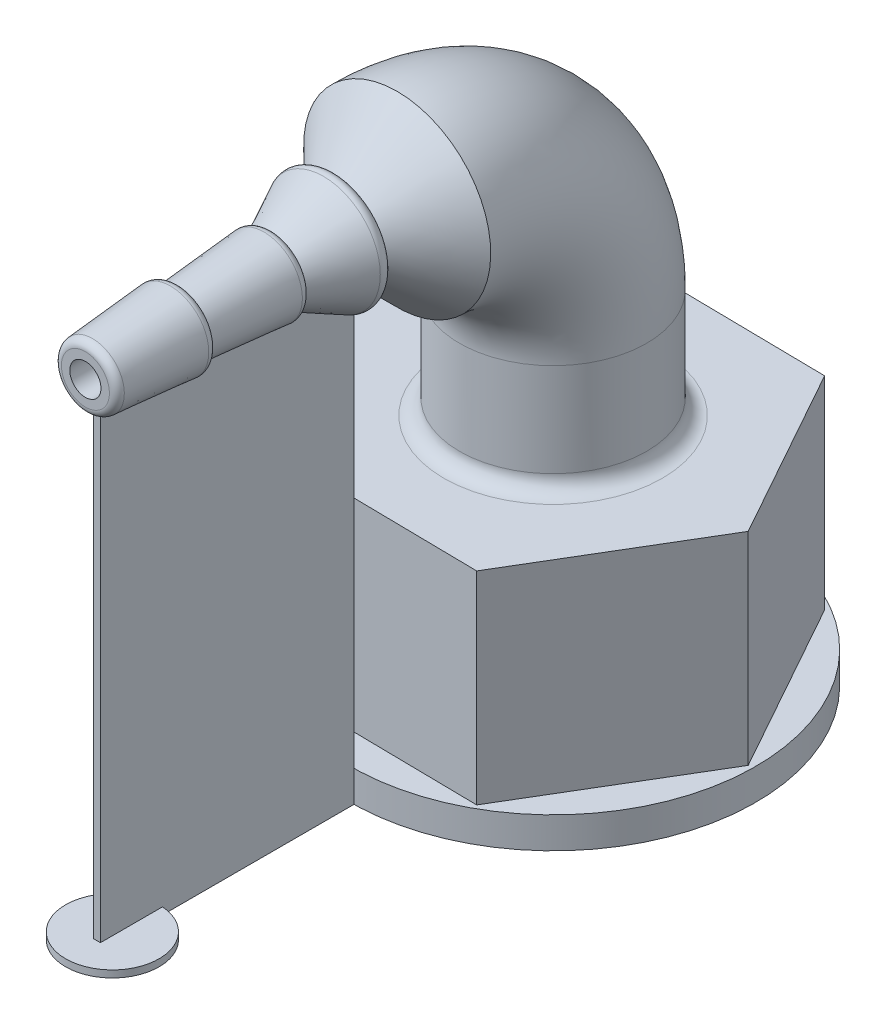
ISO-10303-21;
HEADER;
FILE_DESCRIPTION(('STEP AP214'),'2;1');
FILE_NAME('part.step','',(''),(''),'','','');
FILE_SCHEMA(('AUTOMOTIVE_DESIGN { 1 0 10303 214 1 1 1 1 }'));
ENDSEC;
DATA;
#1=APPLICATION_CONTEXT('core data for automotive mechanical design processes');
#2=APPLICATION_PROTOCOL_DEFINITION('international standard','automotive_design',2000,#1);
#3=PRODUCT_CONTEXT('',#1,'mechanical');
#4=PRODUCT('Part','Part','',(#3));
#5=PRODUCT_RELATED_PRODUCT_CATEGORY('part','',(#4));
#6=PRODUCT_DEFINITION_FORMATION('','',#4);
#7=PRODUCT_DEFINITION_CONTEXT('part definition',#1,'design');
#8=PRODUCT_DEFINITION('design','',#6,#7);
#9=PRODUCT_DEFINITION_SHAPE('','',#8);
#10=(LENGTH_UNIT() NAMED_UNIT(*) SI_UNIT(.MILLI.,.METRE.));
#11=(NAMED_UNIT(*) PLANE_ANGLE_UNIT() SI_UNIT($,.RADIAN.));
#12=(NAMED_UNIT(*) SI_UNIT($,.STERADIAN.) SOLID_ANGLE_UNIT());
#13=UNCERTAINTY_MEASURE_WITH_UNIT(LENGTH_MEASURE(1.E-05),#10,'distance_accuracy_value','');
#14=(GEOMETRIC_REPRESENTATION_CONTEXT(3) GLOBAL_UNCERTAINTY_ASSIGNED_CONTEXT((#13)) GLOBAL_UNIT_ASSIGNED_CONTEXT((#10,
#11,#12)) REPRESENTATION_CONTEXT('',''));
#15=CARTESIAN_POINT('',(0.,0.,0.));
#16=DIRECTION('',(0.,0.,1.));
#17=DIRECTION('',(1.,0.,0.));
#18=AXIS2_PLACEMENT_3D('',#15,#16,#17);
#19=CARTESIAN_POINT('',(0.225,-2.,29.2603334278676));
#20=DIRECTION('',(0.,0.,-1.));
#21=DIRECTION('',(-1.,0.,0.));
#22=AXIS2_PLACEMENT_3D('',#19,#20,#21);
#23=PLANE('',#22);
#24=DIRECTION('',(-1.,0.,0.));
#25=VECTOR('',#24,1.);
#26=CARTESIAN_POINT('',(0.225,-1.55,29.2603334278676));
#27=LINE('',#26,#25);
#28=CARTESIAN_POINT('',(0.225,-1.55,29.2603334278676));
#29=VERTEX_POINT('',#28);
#30=CARTESIAN_POINT('',(-0.225,-1.55,29.2603334278676));
#31=VERTEX_POINT('',#30);
#32=EDGE_CURVE('E153',#29,#31,#27,.T.);
#33=ORIENTED_EDGE('',*,*,#32,.F.);
#34=DIRECTION('',(0.,-1.,0.));
#35=VECTOR('',#34,1.);
#36=CARTESIAN_POINT('',(0.225,-2.,29.2603334278676));
#37=LINE('',#36,#35);
#38=CARTESIAN_POINT('',(0.225,27.938361118989,29.2603334278676));
#39=VERTEX_POINT('',#38);
#40=EDGE_CURVE('E135',#39,#29,#37,.T.);
#41=ORIENTED_EDGE('',*,*,#40,.F.);
#42=DIRECTION('',(-1.,0.,0.));
#43=VECTOR('',#42,1.);
#44=CARTESIAN_POINT('',(0.225,27.938361118989,29.2603334278676));
#45=LINE('',#44,#43);
#46=CARTESIAN_POINT('',(-0.225,27.938361118989,29.2603334278676));
#47=VERTEX_POINT('',#46);
#48=EDGE_CURVE('E137',#39,#47,#45,.T.);
#49=ORIENTED_EDGE('',*,*,#48,.T.);
#50=DIRECTION('',(0.,-1.,0.));
#51=VECTOR('',#50,1.);
#52=CARTESIAN_POINT('',(-0.225,-2.,29.2603334278676));
#53=LINE('',#52,#51);
#54=EDGE_CURVE('E127',#47,#31,#53,.T.);
#55=ORIENTED_EDGE('',*,*,#54,.T.);
#56=EDGE_LOOP('',(#33,#41,#49,#55));
#57=FACE_BOUND('',#56,.T.);
#58=ADVANCED_FACE('F51',(#57),#23,.F.);
#59=CARTESIAN_POINT('',(0.225,-2.,13.));
#60=DIRECTION('',(0.,1.,0.));
#61=DIRECTION('',(0.,0.,1.));
#62=AXIS2_PLACEMENT_3D('',#59,#60,#61);
#63=PLANE('',#62);
#64=DIRECTION('',(0.,0.,-1.));
#65=VECTOR('',#64,1.);
#66=CARTESIAN_POINT('',(0.225,-2.,13.));
#67=LINE('',#66,#65);
#68=CARTESIAN_POINT('',(0.225,-2.,25.2790268081864));
#69=VERTEX_POINT('',#68);
#70=CARTESIAN_POINT('',(0.225,-2.,13.));
#71=VERTEX_POINT('',#70);
#72=EDGE_CURVE('E94',#69,#71,#67,.T.);
#73=ORIENTED_EDGE('',*,*,#72,.F.);
#74=CARTESIAN_POINT('',(0.,-2.,28.2705774094633));
#75=DIRECTION('',(0.,-1.,0.));
#76=DIRECTION('',(0.,0.,-1.));
#77=AXIS2_PLACEMENT_3D('',#74,#75,#76);
#78=CIRCLE('',#77,3.);
#79=CARTESIAN_POINT('',(-0.225,-2.,25.2790268081864));
#80=VERTEX_POINT('',#79);
#81=EDGE_CURVE('E66',#69,#80,#78,.T.);
#82=ORIENTED_EDGE('',*,*,#81,.T.);
#83=DIRECTION('',(0.,0.,-1.));
#84=VECTOR('',#83,1.);
#85=CARTESIAN_POINT('',(-0.225,-2.,13.));
#86=LINE('',#85,#84);
#87=CARTESIAN_POINT('',(-0.225,-2.,13.));
#88=VERTEX_POINT('',#87);
#89=EDGE_CURVE('E121',#80,#88,#86,.T.);
#90=ORIENTED_EDGE('',*,*,#89,.T.);
#91=DIRECTION('',(-1.,0.,0.));
#92=VECTOR('',#91,1.);
#93=CARTESIAN_POINT('',(0.225,-2.,13.));
#94=LINE('',#93,#92);
#95=EDGE_CURVE('E125',#71,#88,#94,.T.);
#96=ORIENTED_EDGE('',*,*,#95,.F.);
#97=EDGE_LOOP('',(#73,#82,#90,#96));
#98=FACE_BOUND('',#97,.T.);
#99=ADVANCED_FACE('F53',(#98),#63,.F.);
#100=CARTESIAN_POINT('',(0.225,27.938361118989,13.));
#101=DIRECTION('',(0.,0.,1.));
#102=DIRECTION('',(1.,0.,0.));
#103=AXIS2_PLACEMENT_3D('',#100,#101,#102);
#104=PLANE('',#103);
#105=DIRECTION('',(0.,1.,0.));
#106=VECTOR('',#105,1.);
#107=CARTESIAN_POINT('',(-0.225,27.938361118989,13.));
#108=LINE('',#107,#106);
#109=CARTESIAN_POINT('',(-0.225,27.938361118989,13.));
#110=VERTEX_POINT('',#109);
#111=EDGE_CURVE('E139',#88,#110,#108,.T.);
#112=ORIENTED_EDGE('',*,*,#111,.T.);
#113=DIRECTION('',(-1.,0.,0.));
#114=VECTOR('',#113,1.);
#115=CARTESIAN_POINT('',(0.225,27.938361118989,13.));
#116=LINE('',#115,#114);
#117=CARTESIAN_POINT('',(0.225,27.938361118989,13.));
#118=VERTEX_POINT('',#117);
#119=EDGE_CURVE('E143',#118,#110,#116,.T.);
#120=ORIENTED_EDGE('',*,*,#119,.F.);
#121=DIRECTION('',(0.,1.,0.));
#122=VECTOR('',#121,1.);
#123=CARTESIAN_POINT('',(0.225,27.938361118989,13.));
#124=LINE('',#123,#122);
#125=EDGE_CURVE('E126',#71,#118,#124,.T.);
#126=ORIENTED_EDGE('',*,*,#125,.F.);
#127=ORIENTED_EDGE('',*,*,#95,.T.);
#128=EDGE_LOOP('',(#112,#120,#126,#127));
#129=FACE_BOUND('',#128,.T.);
#130=ADVANCED_FACE('F158',(#129),#104,.F.);
#131=CARTESIAN_POINT('',(0.225,27.938361118989,29.2603334278676));
#132=DIRECTION('',(0.,-1.,0.));
#133=DIRECTION('',(0.,0.,-1.));
#134=AXIS2_PLACEMENT_3D('',#131,#132,#133);
#135=PLANE('',#134);
#136=DIRECTION('',(0.,0.,1.));
#137=VECTOR('',#136,1.);
#138=CARTESIAN_POINT('',(-0.225,27.938361118989,29.2603334278676));
#139=LINE('',#138,#137);
#140=EDGE_CURVE('E90',#110,#47,#139,.T.);
#141=ORIENTED_EDGE('',*,*,#140,.T.);
#142=ORIENTED_EDGE('',*,*,#48,.F.);
#143=DIRECTION('',(0.,0.,1.));
#144=VECTOR('',#143,1.);
#145=CARTESIAN_POINT('',(0.225,27.938361118989,29.2603334278676));
#146=LINE('',#145,#144);
#147=EDGE_CURVE('E74',#118,#39,#146,.T.);
#148=ORIENTED_EDGE('',*,*,#147,.F.);
#149=ORIENTED_EDGE('',*,*,#119,.T.);
#150=EDGE_LOOP('',(#141,#142,#148,#149));
#151=FACE_BOUND('',#150,.T.);
#152=ADVANCED_FACE('F154',(#151),#135,.F.);
#153=CARTESIAN_POINT('',(0.225,0.,0.));
#154=DIRECTION('',(-1.,0.,0.));
#155=DIRECTION('',(0.,0.,1.));
#156=AXIS2_PLACEMENT_3D('',#153,#154,#155);
#157=PLANE('',#156);
#158=DIRECTION('',(0.,0.,1.));
#159=VECTOR('',#158,1.);
#160=CARTESIAN_POINT('',(0.225,-1.55,0.));
#161=LINE('',#160,#159);
#162=CARTESIAN_POINT('',(0.225,-1.55,25.2790268081864));
#163=VERTEX_POINT('',#162);
#164=EDGE_CURVE('E120',#163,#29,#161,.T.);
#165=ORIENTED_EDGE('',*,*,#164,.F.);
#166=DIRECTION('',(0.,-1.,0.));
#167=VECTOR('',#166,1.);
#168=CARTESIAN_POINT('',(0.225,-1.55,25.2790268081864));
#169=LINE('',#168,#167);
#170=EDGE_CURVE('E112',#163,#69,#169,.T.);
#171=ORIENTED_EDGE('',*,*,#170,.T.);
#172=ORIENTED_EDGE('',*,*,#72,.T.);
#173=ORIENTED_EDGE('',*,*,#125,.T.);
#174=ORIENTED_EDGE('',*,*,#147,.T.);
#175=ORIENTED_EDGE('',*,*,#40,.T.);
#176=EDGE_LOOP('',(#165,#171,#172,#173,#174,#175));
#177=FACE_BOUND('',#176,.T.);
#178=ADVANCED_FACE('F119',(#177),#157,.F.);
#179=CARTESIAN_POINT('',(-0.225,0.,0.));
#180=DIRECTION('',(-1.,0.,0.));
#181=DIRECTION('',(0.,0.,1.));
#182=AXIS2_PLACEMENT_3D('',#179,#180,#181);
#183=PLANE('',#182);
#184=DIRECTION('',(0.,-1.,0.));
#185=VECTOR('',#184,1.);
#186=CARTESIAN_POINT('',(-0.225,-1.55,25.2790268081864));
#187=LINE('',#186,#185);
#188=CARTESIAN_POINT('',(-0.225,-1.55,25.2790268081864));
#189=VERTEX_POINT('',#188);
#190=EDGE_CURVE('E12',#189,#80,#187,.T.);
#191=ORIENTED_EDGE('',*,*,#190,.F.);
#192=DIRECTION('',(0.,0.,1.));
#193=VECTOR('',#192,1.);
#194=CARTESIAN_POINT('',(-0.225,-1.55,0.));
#195=LINE('',#194,#193);
#196=EDGE_CURVE('E59',#189,#31,#195,.T.);
#197=ORIENTED_EDGE('',*,*,#196,.T.);
#198=ORIENTED_EDGE('',*,*,#54,.F.);
#199=ORIENTED_EDGE('',*,*,#140,.F.);
#200=ORIENTED_EDGE('',*,*,#111,.F.);
#201=ORIENTED_EDGE('',*,*,#89,.F.);
#202=EDGE_LOOP('',(#191,#197,#198,#199,#200,#201));
#203=FACE_BOUND('',#202,.T.);
#204=ADVANCED_FACE('F148',(#203),#183,.T.);
#205=CARTESIAN_POINT('',(0.,-1.55,28.2705774094633));
#206=DIRECTION('',(0.,-1.,0.));
#207=DIRECTION('',(0.,0.,-1.));
#208=AXIS2_PLACEMENT_3D('',#205,#206,#207);
#209=CYLINDRICAL_SURFACE('',#208,3.);
#210=ORIENTED_EDGE('',*,*,#170,.F.);
#211=CARTESIAN_POINT('',(0.,-1.55,28.2705774094633));
#212=DIRECTION('',(0.,-1.,0.));
#213=DIRECTION('',(0.,0.,-1.));
#214=AXIS2_PLACEMENT_3D('',#211,#212,#213);
#215=CIRCLE('',#214,3.);
#216=EDGE_CURVE('E116',#163,#189,#215,.T.);
#217=ORIENTED_EDGE('',*,*,#216,.T.);
#218=ORIENTED_EDGE('',*,*,#190,.T.);
#219=ORIENTED_EDGE('',*,*,#81,.F.);
#220=EDGE_LOOP('',(#210,#217,#218,#219));
#221=FACE_BOUND('',#220,.T.);
#222=ADVANCED_FACE('F110',(#221),#209,.T.);
#223=CARTESIAN_POINT('',(0.,-1.55,28.2705774094633));
#224=DIRECTION('',(0.,-1.,0.));
#225=DIRECTION('',(0.,0.,-1.));
#226=AXIS2_PLACEMENT_3D('',#223,#224,#225);
#227=PLANE('',#226);
#228=ORIENTED_EDGE('',*,*,#216,.F.);
#229=ORIENTED_EDGE('',*,*,#164,.T.);
#230=ORIENTED_EDGE('',*,*,#32,.T.);
#231=ORIENTED_EDGE('',*,*,#196,.F.);
#232=EDGE_LOOP('',(#228,#229,#230,#231));
#233=FACE_BOUND('',#232,.T.);
#234=ADVANCED_FACE('F176',(#233),#227,.F.);
#235=CLOSED_SHELL('',(#58,#99,#130,#152,#178,#204,#222,#234));
#236=MANIFOLD_SOLID_BREP('B2',#235);
#237=CARTESIAN_POINT('',(0.,30.,30.));
#238=DIRECTION('',(0.,0.,1.));
#239=DIRECTION('',(0.,-1.,0.));
#240=AXIS2_PLACEMENT_3D('',#237,#238,#239);
#241=PLANE('',#240);
#242=CARTESIAN_POINT('',(0.,30.,30.));
#243=DIRECTION('',(0.,0.,1.));
#244=DIRECTION('',(0.,-1.,0.));
#245=AXIS2_PLACEMENT_3D('',#242,#243,#244);
#246=CIRCLE('',#245,1.53993355921699);
#247=CARTESIAN_POINT('',(0.,28.460066440783,30.));
#248=VERTEX_POINT('',#247);
#249=EDGE_CURVE('E49',#248,#248,#246,.T.);
#250=ORIENTED_EDGE('',*,*,#249,.T.);
#251=EDGE_LOOP('',(#250));
#252=FACE_BOUND('',#251,.T.);
#253=CARTESIAN_POINT('',(0.,30.,30.));
#254=DIRECTION('',(0.,0.,1.));
#255=DIRECTION('',(0.,-1.,0.));
#256=AXIS2_PLACEMENT_3D('',#253,#254,#255);
#257=CIRCLE('',#256,1.);
#258=CARTESIAN_POINT('',(0.,29.,30.));
#259=VERTEX_POINT('',#258);
#260=EDGE_CURVE('E503',#259,#259,#257,.F.);
#261=ORIENTED_EDGE('',*,*,#260,.T.);
#262=EDGE_LOOP('',(#261));
#263=FACE_BOUND('',#262,.T.);
#264=ADVANCED_FACE('F229',(#252,#263),#241,.T.);
#265=CARTESIAN_POINT('',(0.,0.,0.));
#266=DIRECTION('',(0.,1.,0.));
#267=DIRECTION('',(0.,0.,1.));
#268=AXIS2_PLACEMENT_3D('',#265,#266,#267);
#269=PLANE('',#268);
#270=CARTESIAN_POINT('',(0.,0.,0.));
#271=DIRECTION('',(0.,1.,0.));
#272=DIRECTION('',(0.,0.,1.));
#273=AXIS2_PLACEMENT_3D('',#270,#271,#272);
#274=CIRCLE('',#273,4.75);
#275=CARTESIAN_POINT('',(0.,0.,-4.75));
#276=VERTEX_POINT('',#275);
#277=EDGE_CURVE('E307',#276,#276,#274,.T.);
#278=ORIENTED_EDGE('',*,*,#277,.T.);
#279=EDGE_LOOP('',(#278));
#280=FACE_BOUND('',#279,.T.);
#281=CARTESIAN_POINT('',(0.,0.,0.));
#282=DIRECTION('',(0.,-1.,0.));
#283=DIRECTION('',(0.,0.,-1.));
#284=AXIS2_PLACEMENT_3D('',#281,#282,#283);
#285=CIRCLE('',#284,4.76999631989262);
#286=CARTESIAN_POINT('',(0.,0.,-4.76999631989262));
#287=VERTEX_POINT('',#286);
#288=EDGE_CURVE('E516',#287,#287,#285,.T.);
#289=ORIENTED_EDGE('',*,*,#288,.T.);
#290=EDGE_LOOP('',(#289));
#291=FACE_BOUND('',#290,.T.);
#292=ADVANCED_FACE('F397',(#280,#291),#269,.F.);
#293=CARTESIAN_POINT('',(0.,13.,0.));
#294=DIRECTION('',(0.,1.,0.));
#295=DIRECTION('',(0.,0.,1.));
#296=AXIS2_PLACEMENT_3D('',#293,#294,#295);
#297=PLANE('',#296);
#298=CARTESIAN_POINT('',(0.,13.,0.));
#299=DIRECTION('',(0.,1.,0.));
#300=DIRECTION('',(0.,0.,1.));
#301=AXIS2_PLACEMENT_3D('',#298,#299,#300);
#302=CIRCLE('',#301,7.);
#303=CARTESIAN_POINT('',(0.,13.,7.));
#304=VERTEX_POINT('',#303);
#305=EDGE_CURVE('E349',#304,#304,#302,.F.);
#306=ORIENTED_EDGE('',*,*,#305,.T.);
#307=EDGE_LOOP('',(#306));
#308=FACE_BOUND('',#307,.T.);
#309=DIRECTION('',(-0.487283169368928,0.,-0.873244016784411));
#310=VECTOR('',#309,1.);
#311=CARTESIAN_POINT('',(12.7003479437025,13.,0.185729486687596));
#312=LINE('',#311,#310);
#313=CARTESIAN_POINT('',(12.7003479437025,13.,0.185729486687596));
#314=VERTEX_POINT('',#313);
#315=CARTESIAN_POINT('',(6.51102042555455,13.,-10.905959212804));
#316=VERTEX_POINT('',#315);
#317=EDGE_CURVE('E329',#314,#316,#312,.T.);
#318=ORIENTED_EDGE('',*,*,#317,.T.);
#319=DIRECTION('',(-0.999893086922529,0.,-0.0146224048821186));
#320=VECTOR('',#319,1.);
#321=CARTESIAN_POINT('',(6.51102042555455,13.,-10.905959212804));
#322=LINE('',#321,#320);
#323=CARTESIAN_POINT('',(-6.18932751814794,13.,-11.0916886994916));
#324=VERTEX_POINT('',#323);
#325=EDGE_CURVE('E296',#316,#324,#322,.T.);
#326=ORIENTED_EDGE('',*,*,#325,.T.);
#327=DIRECTION('',(-0.5126099175536,0.,0.858621611902292));
#328=VECTOR('',#327,1.);
#329=CARTESIAN_POINT('',(-6.18932751814794,13.,-11.0916886994916));
#330=LINE('',#329,#328);
#331=CARTESIAN_POINT('',(-12.7003479437025,13.,-0.185729486687596));
#332=VERTEX_POINT('',#331);
#333=EDGE_CURVE('E541',#324,#332,#330,.T.);
#334=ORIENTED_EDGE('',*,*,#333,.T.);
#335=DIRECTION('',(0.487283169368928,0.,0.873244016784411));
#336=VECTOR('',#335,1.);
#337=CARTESIAN_POINT('',(-12.7003479437025,13.,-0.185729486687596));
#338=LINE('',#337,#336);
#339=CARTESIAN_POINT('',(-6.51102042555454,13.,10.905959212804));
#340=VERTEX_POINT('',#339);
#341=EDGE_CURVE('E544',#332,#340,#338,.T.);
#342=ORIENTED_EDGE('',*,*,#341,.T.);
#343=DIRECTION('',(0.999893086922529,0.,0.0146224048821183));
#344=VECTOR('',#343,1.);
#345=CARTESIAN_POINT('',(-6.51102042555454,13.,10.905959212804));
#346=LINE('',#345,#344);
#347=CARTESIAN_POINT('',(6.18932751814794,13.,11.0916886994916));
#348=VERTEX_POINT('',#347);
#349=EDGE_CURVE('E546',#340,#348,#346,.T.);
#350=ORIENTED_EDGE('',*,*,#349,.T.);
#351=DIRECTION('',(0.5126099175536,0.,-0.858621611902293));
#352=VECTOR('',#351,1.);
#353=CARTESIAN_POINT('',(6.18932751814794,13.,11.0916886994916));
#354=LINE('',#353,#352);
#355=EDGE_CURVE('E246',#348,#314,#354,.T.);
#356=ORIENTED_EDGE('',*,*,#355,.T.);
#357=EDGE_LOOP('',(#318,#326,#334,#342,#350,#356));
#358=FACE_BOUND('',#357,.T.);
#359=ADVANCED_FACE('F403',(#308,#358),#297,.T.);
#360=CARTESIAN_POINT('',(12.7003479437025,13.,0.185729486687596));
#361=DIRECTION('',(-0.873244016784411,0.,0.487283169368928));
#362=DIRECTION('',(0.487283169368928,0.,0.873244016784411));
#363=AXIS2_PLACEMENT_3D('',#360,#361,#362);
#364=PLANE('',#363);
#365=DIRECTION('',(-0.487283169368928,0.,-0.873244016784411));
#366=VECTOR('',#365,1.);
#367=CARTESIAN_POINT('',(12.7003479437025,0.,0.185729486687596));
#368=LINE('',#367,#366);
#369=CARTESIAN_POINT('',(12.7003479437025,0.,0.185729486687596));
#370=VERTEX_POINT('',#369);
#371=CARTESIAN_POINT('',(6.51102042555455,0.,-10.905959212804));
#372=VERTEX_POINT('',#371);
#373=EDGE_CURVE('E284',#370,#372,#368,.T.);
#374=ORIENTED_EDGE('',*,*,#373,.T.);
#375=DIRECTION('',(0.,-1.,0.));
#376=VECTOR('',#375,1.);
#377=CARTESIAN_POINT('',(6.51102042555455,13.,-10.905959212804));
#378=LINE('',#377,#376);
#379=EDGE_CURVE('E294',#316,#372,#378,.T.);
#380=ORIENTED_EDGE('',*,*,#379,.F.);
#381=ORIENTED_EDGE('',*,*,#317,.F.);
#382=DIRECTION('',(0.,-1.,0.));
#383=VECTOR('',#382,1.);
#384=CARTESIAN_POINT('',(12.7003479437025,13.,0.185729486687596));
#385=LINE('',#384,#383);
#386=EDGE_CURVE('E305',#314,#370,#385,.T.);
#387=ORIENTED_EDGE('',*,*,#386,.T.);
#388=EDGE_LOOP('',(#374,#380,#381,#387));
#389=FACE_BOUND('',#388,.T.);
#390=ADVANCED_FACE('F304',(#389),#364,.F.);
#391=CARTESIAN_POINT('',(6.51102042555455,13.,-10.905959212804));
#392=DIRECTION('',(-0.0146224048821186,0.,0.999893086922529));
#393=DIRECTION('',(0.999893086922529,0.,0.0146224048821186));
#394=AXIS2_PLACEMENT_3D('',#391,#392,#393);
#395=PLANE('',#394);
#396=DIRECTION('',(-0.999893086922529,0.,-0.0146224048821186));
#397=VECTOR('',#396,1.);
#398=CARTESIAN_POINT('',(6.51102042555455,0.,-10.905959212804));
#399=LINE('',#398,#397);
#400=CARTESIAN_POINT('',(-6.18932751814794,0.,-11.0916886994916));
#401=VERTEX_POINT('',#400);
#402=EDGE_CURVE('E279',#372,#401,#399,.T.);
#403=ORIENTED_EDGE('',*,*,#402,.T.);
#404=DIRECTION('',(0.,-1.,0.));
#405=VECTOR('',#404,1.);
#406=CARTESIAN_POINT('',(-6.18932751814794,13.,-11.0916886994916));
#407=LINE('',#406,#405);
#408=EDGE_CURVE('E301',#324,#401,#407,.T.);
#409=ORIENTED_EDGE('',*,*,#408,.F.);
#410=ORIENTED_EDGE('',*,*,#325,.F.);
#411=ORIENTED_EDGE('',*,*,#379,.T.);
#412=EDGE_LOOP('',(#403,#409,#410,#411));
#413=FACE_BOUND('',#412,.T.);
#414=ADVANCED_FACE('F295',(#413),#395,.F.);
#415=CARTESIAN_POINT('',(-6.18932751814794,13.,-11.0916886994916));
#416=DIRECTION('',(0.858621611902293,0.,0.5126099175536));
#417=DIRECTION('',(0.5126099175536,0.,-0.858621611902293));
#418=AXIS2_PLACEMENT_3D('',#415,#416,#417);
#419=PLANE('',#418);
#420=DIRECTION('',(-0.5126099175536,0.,0.858621611902292));
#421=VECTOR('',#420,1.);
#422=CARTESIAN_POINT('',(-6.18932751814794,0.,-11.0916886994916));
#423=LINE('',#422,#421);
#424=CARTESIAN_POINT('',(-12.7003479437025,0.,-0.185729486687596));
#425=VERTEX_POINT('',#424);
#426=EDGE_CURVE('E287',#401,#425,#423,.T.);
#427=ORIENTED_EDGE('',*,*,#426,.T.);
#428=DIRECTION('',(0.,-1.,0.));
#429=VECTOR('',#428,1.);
#430=CARTESIAN_POINT('',(-12.7003479437025,13.,-0.185729486687596));
#431=LINE('',#430,#429);
#432=EDGE_CURVE('E340',#332,#425,#431,.T.);
#433=ORIENTED_EDGE('',*,*,#432,.F.);
#434=ORIENTED_EDGE('',*,*,#333,.F.);
#435=ORIENTED_EDGE('',*,*,#408,.T.);
#436=EDGE_LOOP('',(#427,#433,#434,#435));
#437=FACE_BOUND('',#436,.T.);
#438=ADVANCED_FACE('F453',(#437),#419,.F.);
#439=CARTESIAN_POINT('',(-12.7003479437025,13.,-0.185729486687596));
#440=DIRECTION('',(0.873244016784411,0.,-0.487283169368928));
#441=DIRECTION('',(-0.487283169368928,0.,-0.873244016784411));
#442=AXIS2_PLACEMENT_3D('',#439,#440,#441);
#443=PLANE('',#442);
#444=DIRECTION('',(0.487283169368928,0.,0.873244016784411));
#445=VECTOR('',#444,1.);
#446=CARTESIAN_POINT('',(-12.7003479437025,0.,-0.185729486687596));
#447=LINE('',#446,#445);
#448=CARTESIAN_POINT('',(-6.51102042555454,0.,10.905959212804));
#449=VERTEX_POINT('',#448);
#450=EDGE_CURVE('E318',#425,#449,#447,.T.);
#451=ORIENTED_EDGE('',*,*,#450,.T.);
#452=DIRECTION('',(0.,-1.,0.));
#453=VECTOR('',#452,1.);
#454=CARTESIAN_POINT('',(-6.51102042555454,13.,10.905959212804));
#455=LINE('',#454,#453);
#456=EDGE_CURVE('E336',#340,#449,#455,.T.);
#457=ORIENTED_EDGE('',*,*,#456,.F.);
#458=ORIENTED_EDGE('',*,*,#341,.F.);
#459=ORIENTED_EDGE('',*,*,#432,.T.);
#460=EDGE_LOOP('',(#451,#457,#458,#459));
#461=FACE_BOUND('',#460,.T.);
#462=ADVANCED_FACE('F449',(#461),#443,.F.);
#463=CARTESIAN_POINT('',(-6.51102042555454,13.,10.905959212804));
#464=DIRECTION('',(0.0146224048821183,0.,-0.999893086922529));
#465=DIRECTION('',(-0.999893086922529,0.,-0.0146224048821183));
#466=AXIS2_PLACEMENT_3D('',#463,#464,#465);
#467=PLANE('',#466);
#468=DIRECTION('',(0.999893086922529,0.,0.0146224048821183));
#469=VECTOR('',#468,1.);
#470=CARTESIAN_POINT('',(-6.51102042555454,0.,10.905959212804));
#471=LINE('',#470,#469);
#472=CARTESIAN_POINT('',(6.18932751814794,0.,11.0916886994916));
#473=VERTEX_POINT('',#472);
#474=EDGE_CURVE('E322',#449,#473,#471,.T.);
#475=ORIENTED_EDGE('',*,*,#474,.T.);
#476=DIRECTION('',(0.,-1.,0.));
#477=VECTOR('',#476,1.);
#478=CARTESIAN_POINT('',(6.18932751814794,13.,11.0916886994916));
#479=LINE('',#478,#477);
#480=EDGE_CURVE('E332',#348,#473,#479,.T.);
#481=ORIENTED_EDGE('',*,*,#480,.F.);
#482=ORIENTED_EDGE('',*,*,#349,.F.);
#483=ORIENTED_EDGE('',*,*,#456,.T.);
#484=EDGE_LOOP('',(#475,#481,#482,#483));
#485=FACE_BOUND('',#484,.T.);
#486=ADVANCED_FACE('F445',(#485),#467,.F.);
#487=CARTESIAN_POINT('',(6.18932751814794,13.,11.0916886994916));
#488=DIRECTION('',(-0.858621611902293,0.,-0.5126099175536));
#489=DIRECTION('',(-0.5126099175536,0.,0.858621611902293));
#490=AXIS2_PLACEMENT_3D('',#487,#488,#489);
#491=PLANE('',#490);
#492=DIRECTION('',(0.5126099175536,0.,-0.858621611902293));
#493=VECTOR('',#492,1.);
#494=CARTESIAN_POINT('',(6.18932751814794,0.,11.0916886994916));
#495=LINE('',#494,#493);
#496=EDGE_CURVE('E326',#473,#370,#495,.T.);
#497=ORIENTED_EDGE('',*,*,#496,.T.);
#498=ORIENTED_EDGE('',*,*,#386,.F.);
#499=ORIENTED_EDGE('',*,*,#355,.F.);
#500=ORIENTED_EDGE('',*,*,#480,.T.);
#501=EDGE_LOOP('',(#497,#498,#499,#500));
#502=FACE_BOUND('',#501,.T.);
#503=ADVANCED_FACE('F438',(#502),#491,.F.);
#504=CARTESIAN_POINT('',(0.,13.,0.));
#505=DIRECTION('',(0.,-1.,0.));
#506=DIRECTION('',(0.,0.,-1.));
#507=AXIS2_PLACEMENT_3D('',#504,#505,#506);
#508=CYLINDRICAL_SURFACE('',#507,4.75);
#509=CARTESIAN_POINT('',(0.,13.25,0.));
#510=DIRECTION('',(0.,-1.,0.));
#511=DIRECTION('',(0.,0.,-1.));
#512=AXIS2_PLACEMENT_3D('',#509,#510,#511);
#513=CIRCLE('',#512,4.75);
#514=CARTESIAN_POINT('',(0.,13.25,-4.75));
#515=VERTEX_POINT('',#514);
#516=EDGE_CURVE('E357',#515,#515,#513,.F.);
#517=CARTESIAN_POINT('',(0.,13.25,-4.75));
#518=CARTESIAN_POINT('',(0.,13.1119791666667,-4.75));
#519=CARTESIAN_POINT('',(0.,12.9739583333334,-4.75));
#520=CARTESIAN_POINT('',(0.,12.6979166666667,-4.75));
#521=CARTESIAN_POINT('',(0.,12.5598958333334,-4.75));
#522=CARTESIAN_POINT('',(0.,12.2838541666667,-4.75));
#523=CARTESIAN_POINT('',(0.,12.1458333333334,-4.75));
#524=CARTESIAN_POINT('',(0.,11.8697916666667,-4.75));
#525=CARTESIAN_POINT('',(0.,11.7317708333334,-4.75));
#526=CARTESIAN_POINT('',(0.,11.4557291666667,-4.75));
#527=CARTESIAN_POINT('',(0.,11.3177083333334,-4.75));
#528=CARTESIAN_POINT('',(0.,11.0416666666667,-4.75));
#529=CARTESIAN_POINT('',(0.,10.9036458333334,-4.75));
#530=CARTESIAN_POINT('',(0.,10.6276041666667,-4.75));
#531=CARTESIAN_POINT('',(0.,10.4895833333334,-4.75));
#532=CARTESIAN_POINT('',(0.,10.2135416666667,-4.75));
#533=CARTESIAN_POINT('',(0.,10.0755208333334,-4.75));
#534=CARTESIAN_POINT('',(0.,9.79947916666669,-4.75));
#535=CARTESIAN_POINT('',(0.,9.66145833333336,-4.75));
#536=CARTESIAN_POINT('',(0.,9.38541666666669,-4.75));
#537=CARTESIAN_POINT('',(0.,9.24739583333336,-4.75));
#538=CARTESIAN_POINT('',(0.,8.97135416666669,-4.75));
#539=CARTESIAN_POINT('',(0.,8.83333333333336,-4.75));
#540=CARTESIAN_POINT('',(0.,8.55729166666669,-4.75));
#541=CARTESIAN_POINT('',(0.,8.41927083333336,-4.75));
#542=CARTESIAN_POINT('',(0.,8.14322916666669,-4.75));
#543=CARTESIAN_POINT('',(0.,8.00520833333335,-4.75));
#544=CARTESIAN_POINT('',(0.,7.72916666666669,-4.75));
#545=CARTESIAN_POINT('',(0.,7.59114583333335,-4.75));
#546=CARTESIAN_POINT('',(0.,7.31510416666668,-4.75));
#547=CARTESIAN_POINT('',(0.,7.17708333333335,-4.75));
#548=CARTESIAN_POINT('',(0.,6.90104166666668,-4.75));
#549=CARTESIAN_POINT('',(0.,6.76302083333335,-4.75));
#550=CARTESIAN_POINT('',(0.,6.48697916666668,-4.75));
#551=CARTESIAN_POINT('',(0.,6.34895833333335,-4.75));
#552=CARTESIAN_POINT('',(0.,6.07291666666668,-4.75));
#553=CARTESIAN_POINT('',(0.,5.93489583333335,-4.75));
#554=CARTESIAN_POINT('',(0.,5.65885416666668,-4.75));
#555=CARTESIAN_POINT('',(0.,5.52083333333335,-4.75));
#556=CARTESIAN_POINT('',(0.,5.24479166666668,-4.75));
#557=CARTESIAN_POINT('',(0.,5.10677083333335,-4.75));
#558=CARTESIAN_POINT('',(0.,4.83072916666668,-4.75));
#559=CARTESIAN_POINT('',(0.,4.69270833333334,-4.75));
#560=CARTESIAN_POINT('',(0.,4.41666666666668,-4.75));
#561=CARTESIAN_POINT('',(0.,4.27864583333335,-4.75));
#562=CARTESIAN_POINT('',(0.,4.00260416666668,-4.75));
#563=CARTESIAN_POINT('',(0.,3.86458333333334,-4.75));
#564=CARTESIAN_POINT('',(0.,3.58854166666668,-4.75));
#565=CARTESIAN_POINT('',(0.,3.45052083333334,-4.75));
#566=CARTESIAN_POINT('',(0.,3.17447916666668,-4.75));
#567=CARTESIAN_POINT('',(0.,3.03645833333334,-4.75));
#568=CARTESIAN_POINT('',(0.,2.76041666666667,-4.75));
#569=CARTESIAN_POINT('',(0.,2.62239583333334,-4.75));
#570=CARTESIAN_POINT('',(0.,2.34635416666667,-4.75));
#571=CARTESIAN_POINT('',(0.,2.20833333333334,-4.75));
#572=CARTESIAN_POINT('',(0.,1.93229166666667,-4.75));
#573=CARTESIAN_POINT('',(0.,1.79427083333334,-4.75));
#574=CARTESIAN_POINT('',(0.,1.51822916666667,-4.75));
#575=CARTESIAN_POINT('',(0.,1.38020833333334,-4.75));
#576=CARTESIAN_POINT('',(0.,1.10416666666667,-4.75));
#577=CARTESIAN_POINT('',(0.,0.966145833333337,-4.75));
#578=CARTESIAN_POINT('',(0.,0.690104166666669,-4.75));
#579=CARTESIAN_POINT('',(0.,0.552083333333336,-4.75));
#580=CARTESIAN_POINT('',(0.,0.276041666666669,-4.75));
#581=CARTESIAN_POINT('',(0.,0.138020833333334,-4.75));
#582=CARTESIAN_POINT('',(0.,0.,-4.75));
#583=B_SPLINE_CURVE_WITH_KNOTS('',3,(#517,#518,#519,#520,#521,#522,#523,#524,#525,#526,#527,
#528,#529,#530,#531,#532,#533,#534,#535,#536,#537,#538,#539,#540,#541,#542,#543,#544,#545,#546,
#547,#548,#549,#550,#551,#552,#553,#554,#555,#556,#557,#558,#559,#560,#561,#562,#563,#564,#565,
#566,#567,#568,#569,#570,#571,#572,#573,#574,#575,#576,#577,#578,#579,#580,#581,#582),
.UNSPECIFIED.,.F.,.F.,(4,2,2,2,2,2,2,2,2,2,2,2,2,2,2,2,2,2,2,2,2,2,2,2,2,2,2,2,2,2,2,2,4),(0.,
0.4140625,0.828125000000001,1.2421875,1.65625,2.0703125,2.48437500000001,2.89843750000001,
3.31250000000001,3.72656250000001,4.14062500000001,4.55468750000001,4.96875000000001,
5.38281250000001,5.79687500000001,6.21093750000001,6.62500000000001,7.03906250000002,
7.45312500000002,7.86718750000002,8.28125000000002,8.69531250000002,9.10937500000002,
9.52343750000002,9.93750000000002,10.3515625,10.765625,11.1796875,11.59375,12.0078125,12.421875,
12.8359375,13.25),.UNSPECIFIED.);
#584=EDGE_CURVE('BSEAM429',#515,#276,#583,.T.);
#585=ORIENTED_EDGE('',*,*,#516,.T.);
#586=ORIENTED_EDGE('',*,*,#277,.F.);
#587=ORIENTED_EDGE('',*,*,#584,.T.);
#588=ORIENTED_EDGE('',*,*,#584,.F.);
#589=EDGE_LOOP('',(#585,#587,#586,#588));
#590=FACE_BOUND('',#589,.T.);
#591=ADVANCED_FACE('F429',(#590),#508,.F.);
#592=CARTESIAN_POINT('',(0.,-2.,0.));
#593=DIRECTION('',(0.,-1.,0.));
#594=DIRECTION('',(0.,0.,-1.));
#595=AXIS2_PLACEMENT_3D('',#592,#593,#594);
#596=PLANE('',#595);
#597=CARTESIAN_POINT('',(0.,-2.,0.));
#598=DIRECTION('',(0.,-1.,0.));
#599=DIRECTION('',(0.,0.,-1.));
#600=AXIS2_PLACEMENT_3D('',#597,#598,#599);
#601=CIRCLE('',#600,13.);
#602=CARTESIAN_POINT('',(0.,-2.,-13.));
#603=VERTEX_POINT('',#602);
#604=EDGE_CURVE('E311',#603,#603,#601,.T.);
#605=ORIENTED_EDGE('',*,*,#604,.T.);
#606=EDGE_LOOP('',(#605));
#607=FACE_BOUND('',#606,.T.);
#608=CARTESIAN_POINT('',(0.,-2.,0.));
#609=DIRECTION('',(0.,-1.,0.));
#610=DIRECTION('',(0.,0.,-1.));
#611=AXIS2_PLACEMENT_3D('',#608,#609,#610);
#612=CIRCLE('',#611,4.76999631989262);
#613=CARTESIAN_POINT('',(0.,-2.,-4.76999631989262));
#614=VERTEX_POINT('',#613);
#615=EDGE_CURVE('E523',#614,#614,#612,.T.);
#616=ORIENTED_EDGE('',*,*,#615,.F.);
#617=EDGE_LOOP('',(#616));
#618=FACE_BOUND('',#617,.T.);
#619=ADVANCED_FACE('F426',(#607,#618),#596,.T.);
#620=CARTESIAN_POINT('',(0.,0.,0.));
#621=DIRECTION('',(0.,-1.,0.));
#622=DIRECTION('',(0.,0.,-1.));
#623=AXIS2_PLACEMENT_3D('',#620,#621,#622);
#624=PLANE('',#623);
#625=ORIENTED_EDGE('',*,*,#373,.F.);
#626=ORIENTED_EDGE('',*,*,#496,.F.);
#627=ORIENTED_EDGE('',*,*,#474,.F.);
#628=ORIENTED_EDGE('',*,*,#450,.F.);
#629=ORIENTED_EDGE('',*,*,#426,.F.);
#630=ORIENTED_EDGE('',*,*,#402,.F.);
#631=EDGE_LOOP('',(#625,#626,#627,#628,#629,#630));
#632=FACE_BOUND('',#631,.T.);
#633=CARTESIAN_POINT('',(0.,0.,0.));
#634=DIRECTION('',(0.,-1.,0.));
#635=DIRECTION('',(0.,0.,-1.));
#636=AXIS2_PLACEMENT_3D('',#633,#634,#635);
#637=CIRCLE('',#636,13.);
#638=CARTESIAN_POINT('',(0.,0.,-13.));
#639=VERTEX_POINT('',#638);
#640=EDGE_CURVE('E527',#639,#639,#637,.T.);
#641=ORIENTED_EDGE('',*,*,#640,.F.);
#642=EDGE_LOOP('',(#641));
#643=FACE_BOUND('',#642,.T.);
#644=ADVANCED_FACE('F281',(#632,#643),#624,.F.);
#645=CARTESIAN_POINT('',(0.,-2.,0.));
#646=DIRECTION('',(0.,1.,0.));
#647=DIRECTION('',(0.,0.,1.));
#648=AXIS2_PLACEMENT_3D('',#645,#646,#647);
#649=CYLINDRICAL_SURFACE('',#648,13.);
#650=ORIENTED_EDGE('',*,*,#604,.F.);
#651=EDGE_LOOP('',(#650));
#652=FACE_BOUND('',#651,.T.);
#653=ORIENTED_EDGE('',*,*,#640,.T.);
#654=EDGE_LOOP('',(#653));
#655=FACE_BOUND('',#654,.T.);
#656=ADVANCED_FACE('F424',(#652,#655),#649,.T.);
#657=CARTESIAN_POINT('',(0.,-2.,0.));
#658=DIRECTION('',(0.,1.,0.));
#659=DIRECTION('',(0.,0.,1.));
#660=AXIS2_PLACEMENT_3D('',#657,#658,#659);
#661=CYLINDRICAL_SURFACE('',#660,4.76999631989262);
#662=ORIENTED_EDGE('',*,*,#615,.T.);
#663=EDGE_LOOP('',(#662));
#664=FACE_BOUND('',#663,.T.);
#665=ORIENTED_EDGE('',*,*,#288,.F.);
#666=EDGE_LOOP('',(#665));
#667=FACE_BOUND('',#666,.T.);
#668=ADVANCED_FACE('F415',(#664,#667),#661,.F.);
#669=CARTESIAN_POINT('',(0.,19.9999999999999,10.0000000000001));
#670=DIRECTION('',(-1.,0.,0.));
#671=DIRECTION('',(0.,0.,1.));
#672=AXIS2_PLACEMENT_3D('',#669,#670,#671);
#673=TOROIDAL_SURFACE('',#672,10.0000000000001,6.);
#674=CARTESIAN_POINT('',(0.,30.,10.0000000000001));
#675=DIRECTION('',(0.,0.,1.));
#676=DIRECTION('',(0.,-1.,0.));
#677=AXIS2_PLACEMENT_3D('',#674,#675,#676);
#678=CIRCLE('',#677,6.);
#679=CARTESIAN_POINT('',(0.,36.,10.0000000000001));
#680=VERTEX_POINT('',#679);
#681=EDGE_CURVE('E499',#680,#680,#678,.T.);
#682=CARTESIAN_POINT('',(0.,19.9999999999999,0.));
#683=DIRECTION('',(0.,1.,0.));
#684=DIRECTION('',(0.,0.,1.));
#685=AXIS2_PLACEMENT_3D('',#682,#683,#684);
#686=CIRCLE('',#685,6.);
#687=CARTESIAN_POINT('',(0.,19.9999999999999,-6.));
#688=VERTEX_POINT('',#687);
#689=EDGE_CURVE('E508',#688,#688,#686,.T.);
#690=CARTESIAN_POINT('',(0.,19.9999999999999,10.0000000000001));
#691=DIRECTION('',(-1.,0.,0.));
#692=DIRECTION('',(0.,0.,1.));
#693=AXIS2_PLACEMENT_3D('',#690,#691,#692);
#694=CIRCLE('',#693,16.0000000000001);
#695=EDGE_CURVE('',#680,#688,#694,.T.);
#696=ORIENTED_EDGE('',*,*,#681,.F.);
#697=ORIENTED_EDGE('',*,*,#689,.T.);
#698=ORIENTED_EDGE('',*,*,#695,.T.);
#699=ORIENTED_EDGE('',*,*,#695,.F.);
#700=EDGE_LOOP('',(#696,#698,#697,#699));
#701=FACE_BOUND('',#700,.T.);
#702=ADVANCED_FACE('F411',(#701),#673,.T.);
#703=CARTESIAN_POINT('',(0.,19.9999999999999,0.));
#704=DIRECTION('',(0.,-1.,0.));
#705=DIRECTION('',(0.,0.,-1.));
#706=AXIS2_PLACEMENT_3D('',#703,#704,#705);
#707=CYLINDRICAL_SURFACE('',#706,6.);
#708=CARTESIAN_POINT('',(0.,14.,0.));
#709=DIRECTION('',(0.,1.,0.));
#710=DIRECTION('',(0.,0.,1.));
#711=AXIS2_PLACEMENT_3D('',#708,#709,#710);
#712=CIRCLE('',#711,6.);
#713=CARTESIAN_POINT('',(0.,14.,6.));
#714=VERTEX_POINT('',#713);
#715=EDGE_CURVE('E300',#714,#714,#712,.T.);
#716=ORIENTED_EDGE('',*,*,#715,.T.);
#717=EDGE_LOOP('',(#716));
#718=FACE_BOUND('',#717,.T.);
#719=ORIENTED_EDGE('',*,*,#689,.F.);
#720=EDGE_LOOP('',(#719));
#721=FACE_BOUND('',#720,.T.);
#722=ADVANCED_FACE('F414',(#718,#721),#707,.T.);
#723=CARTESIAN_POINT('',(0.,30.,30.));
#724=DIRECTION('',(0.,0.,-1.));
#725=DIRECTION('',(0.,1.,0.));
#726=AXIS2_PLACEMENT_3D('',#723,#724,#725);
#727=CYLINDRICAL_SURFACE('',#726,1.);
#728=CARTESIAN_POINT('',(0.,30.,10.0000000000001));
#729=DIRECTION('',(0.,0.,1.));
#730=DIRECTION('',(0.,-1.,0.));
#731=AXIS2_PLACEMENT_3D('',#728,#729,#730);
#732=CIRCLE('',#731,1.);
#733=CARTESIAN_POINT('',(0.,31.,10.0000000000001));
#734=VERTEX_POINT('',#733);
#735=EDGE_CURVE('E507',#734,#734,#732,.F.);
#736=ORIENTED_EDGE('',*,*,#735,.T.);
#737=EDGE_LOOP('',(#736));
#738=FACE_BOUND('',#737,.T.);
#739=ORIENTED_EDGE('',*,*,#260,.F.);
#740=EDGE_LOOP('',(#739));
#741=FACE_BOUND('',#740,.T.);
#742=ADVANCED_FACE('F420',(#738,#741),#727,.F.);
#743=CARTESIAN_POINT('',(0.,19.9999999999999,10.0000000000001));
#744=DIRECTION('',(-1.,0.,0.));
#745=DIRECTION('',(0.,0.,1.));
#746=AXIS2_PLACEMENT_3D('',#743,#744,#745);
#747=TOROIDAL_SURFACE('',#746,10.0000000000001,1.);
#748=CARTESIAN_POINT('',(0.,19.9999999999999,0.));
#749=DIRECTION('',(0.,1.,0.));
#750=DIRECTION('',(0.,0.,1.));
#751=AXIS2_PLACEMENT_3D('',#748,#749,#750);
#752=CIRCLE('',#751,1.);
#753=CARTESIAN_POINT('',(0.,19.9999999999999,-1.));
#754=VERTEX_POINT('',#753);
#755=EDGE_CURVE('E512',#754,#754,#752,.F.);
#756=CARTESIAN_POINT('',(0.,19.9999999999999,10.0000000000001));
#757=DIRECTION('',(-1.,0.,0.));
#758=DIRECTION('',(0.,0.,1.));
#759=AXIS2_PLACEMENT_3D('',#756,#757,#758);
#760=CIRCLE('',#759,11.0000000000001);
#761=EDGE_CURVE('',#734,#754,#760,.T.);
#762=ORIENTED_EDGE('',*,*,#735,.F.);
#763=ORIENTED_EDGE('',*,*,#755,.T.);
#764=ORIENTED_EDGE('',*,*,#761,.T.);
#765=ORIENTED_EDGE('',*,*,#761,.F.);
#766=EDGE_LOOP('',(#762,#764,#763,#765));
#767=FACE_BOUND('',#766,.T.);
#768=ADVANCED_FACE('F581',(#767),#747,.F.);
#769=CARTESIAN_POINT('',(0.,19.9999999999999,0.));
#770=DIRECTION('',(0.,-1.,0.));
#771=DIRECTION('',(0.,0.,-1.));
#772=AXIS2_PLACEMENT_3D('',#769,#770,#771);
#773=CYLINDRICAL_SURFACE('',#772,1.);
#774=CARTESIAN_POINT('',(0.,17.0000000000001,0.));
#775=DIRECTION('',(0.,1.,0.));
#776=DIRECTION('',(0.,0.,1.));
#777=AXIS2_PLACEMENT_3D('',#774,#775,#776);
#778=CIRCLE('',#777,1.);
#779=CARTESIAN_POINT('',(0.,17.0000000000001,-0.999999999999998));
#780=VERTEX_POINT('',#779);
#781=EDGE_CURVE('E353',#780,#780,#778,.F.);
#782=ORIENTED_EDGE('',*,*,#781,.T.);
#783=EDGE_LOOP('',(#782));
#784=FACE_BOUND('',#783,.T.);
#785=ORIENTED_EDGE('',*,*,#755,.F.);
#786=EDGE_LOOP('',(#785));
#787=FACE_BOUND('',#786,.T.);
#788=ADVANCED_FACE('F409',(#784,#787),#773,.F.);
#789=CARTESIAN_POINT('',(0.,14.,0.));
#790=DIRECTION('',(0.,1.,0.));
#791=DIRECTION('',(0.,0.,1.));
#792=AXIS2_PLACEMENT_3D('',#789,#790,#791);
#793=TOROIDAL_SURFACE('',#792,7.,1.);
#794=ORIENTED_EDGE('',*,*,#305,.F.);
#795=EDGE_LOOP('',(#794));
#796=FACE_BOUND('',#795,.T.);
#797=ORIENTED_EDGE('',*,*,#715,.F.);
#798=EDGE_LOOP('',(#797));
#799=FACE_BOUND('',#798,.T.);
#800=ADVANCED_FACE('F417',(#796,#799),#793,.F.);
#801=CARTESIAN_POINT('',(0.,17.0000000000001,0.));
#802=DIRECTION('',(0.,-1.,0.));
#803=DIRECTION('',(0.,0.,-1.));
#804=AXIS2_PLACEMENT_3D('',#801,#802,#803);
#805=CONICAL_SURFACE('',#804,1.,0.785398163397443);
#806=CARTESIAN_POINT('',(0.,13.25,-4.75));
#807=CARTESIAN_POINT('',(0.,13.2890625,-4.7109375));
#808=CARTESIAN_POINT('',(0.,13.328125,-4.671875));
#809=CARTESIAN_POINT('',(0.,13.40625,-4.59375));
#810=CARTESIAN_POINT('',(0.,13.4453125,-4.5546875));
#811=CARTESIAN_POINT('',(0.,13.5234375,-4.4765625));
#812=CARTESIAN_POINT('',(0.,13.5625,-4.4375));
#813=CARTESIAN_POINT('',(0.,13.640625,-4.359375));
#814=CARTESIAN_POINT('',(0.,13.6796875,-4.3203125));
#815=CARTESIAN_POINT('',(0.,13.7578125,-4.2421875));
#816=CARTESIAN_POINT('',(0.,13.796875,-4.203125));
#817=CARTESIAN_POINT('',(0.,13.875,-4.125));
#818=CARTESIAN_POINT('',(0.,13.9140625,-4.0859375));
#819=CARTESIAN_POINT('',(0.,13.9921875,-4.0078125));
#820=CARTESIAN_POINT('',(0.,14.03125,-3.96875));
#821=CARTESIAN_POINT('',(0.,14.109375,-3.890625));
#822=CARTESIAN_POINT('',(0.,14.1484375,-3.8515625));
#823=CARTESIAN_POINT('',(0.,14.2265625,-3.7734375));
#824=CARTESIAN_POINT('',(0.,14.265625,-3.734375));
#825=CARTESIAN_POINT('',(0.,14.34375,-3.65625));
#826=CARTESIAN_POINT('',(0.,14.3828125,-3.6171875));
#827=CARTESIAN_POINT('',(0.,14.4609375,-3.5390625));
#828=CARTESIAN_POINT('',(0.,14.5,-3.5));
#829=CARTESIAN_POINT('',(0.,14.578125,-3.421875));
#830=CARTESIAN_POINT('',(0.,14.6171875,-3.3828125));
#831=CARTESIAN_POINT('',(0.,14.6953125,-3.3046875));
#832=CARTESIAN_POINT('',(0.,14.734375,-3.265625));
#833=CARTESIAN_POINT('',(0.,14.8125,-3.1875));
#834=CARTESIAN_POINT('',(0.,14.8515625,-3.1484375));
#835=CARTESIAN_POINT('',(0.,14.9296875,-3.0703125));
#836=CARTESIAN_POINT('',(0.,14.96875,-3.03125));
#837=CARTESIAN_POINT('',(0.,15.0468750000001,-2.953125));
#838=CARTESIAN_POINT('',(0.,15.0859375000001,-2.9140625));
#839=CARTESIAN_POINT('',(0.,15.1640625000001,-2.8359375));
#840=CARTESIAN_POINT('',(0.,15.2031250000001,-2.796875));
#841=CARTESIAN_POINT('',(0.,15.2812500000001,-2.71875));
#842=CARTESIAN_POINT('',(0.,15.3203125000001,-2.6796875));
#843=CARTESIAN_POINT('',(0.,15.3984375000001,-2.6015625));
#844=CARTESIAN_POINT('',(0.,15.4375000000001,-2.5625));
#845=CARTESIAN_POINT('',(0.,15.5156250000001,-2.484375));
#846=CARTESIAN_POINT('',(0.,15.5546875000001,-2.4453125));
#847=CARTESIAN_POINT('',(0.,15.6328125000001,-2.3671875));
#848=CARTESIAN_POINT('',(0.,15.6718750000001,-2.328125));
#849=CARTESIAN_POINT('',(0.,15.7500000000001,-2.25));
#850=CARTESIAN_POINT('',(0.,15.7890625000001,-2.2109375));
#851=CARTESIAN_POINT('',(0.,15.8671875000001,-2.1328125));
#852=CARTESIAN_POINT('',(0.,15.9062500000001,-2.09375));
#853=CARTESIAN_POINT('',(0.,15.9843750000001,-2.015625));
#854=CARTESIAN_POINT('',(0.,16.0234375000001,-1.9765625));
#855=CARTESIAN_POINT('',(0.,16.1015625000001,-1.8984375));
#856=CARTESIAN_POINT('',(0.,16.1406250000001,-1.859375));
#857=CARTESIAN_POINT('',(0.,16.2187500000001,-1.78125));
#858=CARTESIAN_POINT('',(0.,16.2578125000001,-1.7421875));
#859=CARTESIAN_POINT('',(0.,16.3359375000001,-1.6640625));
#860=CARTESIAN_POINT('',(0.,16.3750000000001,-1.625));
#861=CARTESIAN_POINT('',(0.,16.4531250000001,-1.546875));
#862=CARTESIAN_POINT('',(0.,16.4921875000001,-1.5078125));
#863=CARTESIAN_POINT('',(0.,16.5703125000001,-1.4296875));
#864=CARTESIAN_POINT('',(0.,16.6093750000001,-1.390625));
#865=CARTESIAN_POINT('',(0.,16.6875000000001,-1.3125));
#866=CARTESIAN_POINT('',(0.,16.7265625000001,-1.2734375));
#867=CARTESIAN_POINT('',(0.,16.8046875000001,-1.1953125));
#868=CARTESIAN_POINT('',(0.,16.8437500000001,-1.15625));
#869=CARTESIAN_POINT('',(0.,16.9218750000001,-1.078125));
#870=CARTESIAN_POINT('',(0.,16.9609375000001,-1.0390625));
#871=CARTESIAN_POINT('',(0.,17.0000000000001,-0.999999999999998));
#872=B_SPLINE_CURVE_WITH_KNOTS('',3,(#806,#807,#808,#809,#810,#811,#812,#813,#814,#815,#816,
#817,#818,#819,#820,#821,#822,#823,#824,#825,#826,#827,#828,#829,#830,#831,#832,#833,#834,#835,
#836,#837,#838,#839,#840,#841,#842,#843,#844,#845,#846,#847,#848,#849,#850,#851,#852,#853,#854,
#855,#856,#857,#858,#859,#860,#861,#862,#863,#864,#865,#866,#867,#868,#869,#870,#871),
.UNSPECIFIED.,.F.,.F.,(4,2,2,2,2,2,2,2,2,2,2,2,2,2,2,2,2,2,2,2,2,2,2,2,2,2,2,2,2,2,2,2,4),(0.,
0.165728151840598,0.331456303681196,0.497184455521794,0.662912607362391,0.828640759202989,
0.994368911043587,1.16009706288419,1.32582521472478,1.49155336656538,1.65728151840598,
1.82300967024658,1.98873782208718,2.15446597392777,2.32019412576837,2.48592227760897,
2.65165042944957,2.81737858129016,2.98310673313076,3.14883488497136,3.31456303681196,
3.48029118865256,3.64601934049316,3.81174749233375,3.97747564417435,4.14320379601495,
4.30893194785555,4.47466009969614,4.64038825153674,4.80611640337734,4.97184455521794,
5.13757270705854,5.30330085889913),.UNSPECIFIED.);
#873=EDGE_CURVE('BSEAM464',#515,#780,#872,.T.);
#874=ORIENTED_EDGE('',*,*,#516,.F.);
#875=ORIENTED_EDGE('',*,*,#781,.F.);
#876=ORIENTED_EDGE('',*,*,#873,.T.);
#877=ORIENTED_EDGE('',*,*,#873,.F.);
#878=EDGE_LOOP('',(#874,#876,#875,#877));
#879=FACE_BOUND('',#878,.T.);
#880=ADVANCED_FACE('F464',(#879),#805,.F.);
#881=CARTESIAN_POINT('',(0.,30.,14.));
#882=DIRECTION('',(0.,0.,-1.));
#883=DIRECTION('',(-1.,0.,0.));
#884=AXIS2_PLACEMENT_3D('',#881,#882,#883);
#885=CONICAL_SURFACE('',#884,2.,0.785398163397459);
#886=ORIENTED_EDGE('',*,*,#681,.T.);
#887=EDGE_LOOP('',(#886));
#888=FACE_BOUND('',#887,.T.);
#889=CARTESIAN_POINT('',(0.,30.,14.));
#890=DIRECTION('',(0.,0.,1.));
#891=DIRECTION('',(1.,0.,0.));
#892=AXIS2_PLACEMENT_3D('',#889,#890,#891);
#893=CIRCLE('',#892,2.);
#894=CARTESIAN_POINT('',(2.,30.,14.));
#895=VERTEX_POINT('',#894);
#896=EDGE_CURVE('E493',#895,#895,#893,.T.);
#897=ORIENTED_EDGE('',*,*,#896,.F.);
#898=EDGE_LOOP('',(#897));
#899=FACE_BOUND('',#898,.T.);
#900=ADVANCED_FACE('F471',(#888,#899),#885,.T.);
#901=CARTESIAN_POINT('',(0.,34.,14.));
#902=DIRECTION('',(0.,0.,-1.));
#903=DIRECTION('',(-1.,0.,0.));
#904=AXIS2_PLACEMENT_3D('',#901,#902,#903);
#905=PLANE('',#904);
#906=CARTESIAN_POINT('',(0.,30.,14.));
#907=DIRECTION('',(0.,0.,-1.));
#908=DIRECTION('',(-1.,0.,0.));
#909=AXIS2_PLACEMENT_3D('',#906,#907,#908);
#910=CIRCLE('',#909,3.19098300562505);
#911=CARTESIAN_POINT('',(-3.19098300562505,30.,14.));
#912=VERTEX_POINT('',#911);
#913=EDGE_CURVE('E365',#912,#912,#910,.T.);
#914=ORIENTED_EDGE('',*,*,#913,.T.);
#915=EDGE_LOOP('',(#914));
#916=FACE_BOUND('',#915,.T.);
#917=ORIENTED_EDGE('',*,*,#896,.T.);
#918=EDGE_LOOP('',(#917));
#919=FACE_BOUND('',#918,.T.);
#920=ADVANCED_FACE('F487',(#916,#919),#905,.T.);
#921=CARTESIAN_POINT('',(0.,30.,18.));
#922=DIRECTION('',(0.,0.,-1.));
#923=DIRECTION('',(-1.,0.,0.));
#924=AXIS2_PLACEMENT_3D('',#921,#922,#923);
#925=CONICAL_SURFACE('',#924,2.,0.463647609000806);
#926=CARTESIAN_POINT('',(0.,30.,14.72360679775));
#927=DIRECTION('',(0.,0.,1.));
#928=DIRECTION('',(1.,0.,0.));
#929=AXIS2_PLACEMENT_3D('',#926,#927,#928);
#930=CIRCLE('',#929,3.63819660112501);
#931=CARTESIAN_POINT('',(3.63819660112501,30.,14.72360679775));
#932=VERTEX_POINT('',#931);
#933=EDGE_CURVE('E361',#932,#932,#930,.T.);
#934=ORIENTED_EDGE('',*,*,#933,.T.);
#935=EDGE_LOOP('',(#934));
#936=FACE_BOUND('',#935,.T.);
#937=CARTESIAN_POINT('',(0.,30.,18.));
#938=DIRECTION('',(0.,0.,1.));
#939=DIRECTION('',(1.,0.,0.));
#940=AXIS2_PLACEMENT_3D('',#937,#938,#939);
#941=CIRCLE('',#940,2.);
#942=CARTESIAN_POINT('',(2.,30.,18.));
#943=VERTEX_POINT('',#942);
#944=EDGE_CURVE('E491',#943,#943,#941,.T.);
#945=ORIENTED_EDGE('',*,*,#944,.F.);
#946=EDGE_LOOP('',(#945));
#947=FACE_BOUND('',#946,.T.);
#948=ADVANCED_FACE('F484',(#936,#947),#925,.T.);
#949=CARTESIAN_POINT('',(0.,30.,24.));
#950=DIRECTION('',(0.,0.,-1.));
#951=DIRECTION('',(-1.,0.,0.));
#952=AXIS2_PLACEMENT_3D('',#949,#950,#951);
#953=CONICAL_SURFACE('',#952,2.,0.0831412318884402);
#954=CARTESIAN_POINT('',(0.,30.,18.5396492168157));
#955=DIRECTION('',(0.,0.,-1.));
#956=DIRECTION('',(-1.,0.,0.));
#957=AXIS2_PLACEMENT_3D('',#954,#955,#956);
#958=CIRCLE('',#957,2.45502923193202);
#959=CARTESIAN_POINT('',(-2.45502923193202,30.,18.5396492168157));
#960=VERTEX_POINT('',#959);
#961=EDGE_CURVE('E369',#960,#960,#958,.F.);
#962=ORIENTED_EDGE('',*,*,#961,.T.);
#963=EDGE_LOOP('',(#962));
#964=FACE_BOUND('',#963,.T.);
#965=CARTESIAN_POINT('',(0.,30.,24.));
#966=DIRECTION('',(0.,0.,1.));
#967=DIRECTION('',(1.,0.,0.));
#968=AXIS2_PLACEMENT_3D('',#965,#966,#967);
#969=CIRCLE('',#968,2.);
#970=CARTESIAN_POINT('',(2.,30.,24.));
#971=VERTEX_POINT('',#970);
#972=EDGE_CURVE('E494',#971,#971,#969,.T.);
#973=ORIENTED_EDGE('',*,*,#972,.F.);
#974=EDGE_LOOP('',(#973));
#975=FACE_BOUND('',#974,.T.);
#976=ADVANCED_FACE('F478',(#964,#975),#953,.T.);
#977=CARTESIAN_POINT('',(0.,30.,30.));
#978=DIRECTION('',(0.,0.,-1.));
#979=DIRECTION('',(-1.,0.,0.));
#980=AXIS2_PLACEMENT_3D('',#977,#978,#979);
#981=CONICAL_SURFACE('',#980,2.,0.0831412318884413);
#982=CARTESIAN_POINT('',(0.,30.,24.539649216816));
#983=DIRECTION('',(0.,0.,-1.));
#984=DIRECTION('',(-1.,0.,0.));
#985=AXIS2_PLACEMENT_3D('',#982,#983,#984);
#986=CIRCLE('',#985,2.455029231932);
#987=CARTESIAN_POINT('',(-2.455029231932,30.,24.539649216816));
#988=VERTEX_POINT('',#987);
#989=EDGE_CURVE('E239',#988,#988,#986,.F.);
#990=ORIENTED_EDGE('',*,*,#989,.T.);
#991=EDGE_LOOP('',(#990));
#992=FACE_BOUND('',#991,.T.);
#993=CARTESIAN_POINT('',(0.,30.,29.5415227399269));
#994=DIRECTION('',(0.,0.,1.));
#995=DIRECTION('',(0.,-1.,0.));
#996=AXIS2_PLACEMENT_3D('',#993,#994,#995);
#997=CIRCLE('',#996,2.03820643833943);
#998=CARTESIAN_POINT('',(0.,27.9617935616606,29.5415227399269));
#999=VERTEX_POINT('',#998);
#1000=EDGE_CURVE('E373',#999,#999,#997,.F.);
#1001=ORIENTED_EDGE('',*,*,#1000,.T.);
#1002=EDGE_LOOP('',(#1001));
#1003=FACE_BOUND('',#1002,.T.);
#1004=ADVANCED_FACE('F380',(#992,#1003),#981,.T.);
#1005=CARTESIAN_POINT('',(0.,30.,14.5));
#1006=DIRECTION('',(0.,0.,-1.));
#1007=DIRECTION('',(-1.,0.,0.));
#1008=AXIS2_PLACEMENT_3D('',#1005,#1006,#1007);
#1009=TOROIDAL_SURFACE('',#1008,3.19098300562505,0.5);
#1010=ORIENTED_EDGE('',*,*,#913,.F.);
#1011=EDGE_LOOP('',(#1010));
#1012=FACE_BOUND('',#1011,.T.);
#1013=ORIENTED_EDGE('',*,*,#933,.F.);
#1014=EDGE_LOOP('',(#1013));
#1015=FACE_BOUND('',#1014,.T.);
#1016=ADVANCED_FACE('F392',(#1012,#1015),#1009,.T.);
#1017=CARTESIAN_POINT('',(0.,30.,18.4981264768888));
#1018=DIRECTION('',(0.,0.,-1.));
#1019=DIRECTION('',(-1.,0.,0.));
#1020=AXIS2_PLACEMENT_3D('',#1017,#1018,#1019);
#1021=TOROIDAL_SURFACE('',#1020,1.95675635280958,0.5);
#1022=ORIENTED_EDGE('',*,*,#944,.T.);
#1023=EDGE_LOOP('',(#1022));
#1024=FACE_BOUND('',#1023,.T.);
#1025=ORIENTED_EDGE('',*,*,#961,.F.);
#1026=EDGE_LOOP('',(#1025));
#1027=FACE_BOUND('',#1026,.T.);
#1028=ADVANCED_FACE('F385',(#1024,#1027),#1021,.T.);
#1029=CARTESIAN_POINT('',(0.,30.,24.4981264768891));
#1030=DIRECTION('',(0.,0.,-1.));
#1031=DIRECTION('',(-1.,0.,0.));
#1032=AXIS2_PLACEMENT_3D('',#1029,#1030,#1031);
#1033=TOROIDAL_SURFACE('',#1032,1.95675635280956,0.5);
#1034=ORIENTED_EDGE('',*,*,#972,.T.);
#1035=EDGE_LOOP('',(#1034));
#1036=FACE_BOUND('',#1035,.T.);
#1037=ORIENTED_EDGE('',*,*,#989,.F.);
#1038=EDGE_LOOP('',(#1037));
#1039=FACE_BOUND('',#1038,.T.);
#1040=ADVANCED_FACE('F383',(#1036,#1039),#1033,.T.);
#1041=CARTESIAN_POINT('',(0.,30.,29.5));
#1042=DIRECTION('',(0.,0.,1.));
#1043=DIRECTION('',(0.,-1.,0.));
#1044=AXIS2_PLACEMENT_3D('',#1041,#1042,#1043);
#1045=TOROIDAL_SURFACE('',#1044,1.53993355921699,0.5);
#1046=ORIENTED_EDGE('',*,*,#1000,.F.);
#1047=EDGE_LOOP('',(#1046));
#1048=FACE_BOUND('',#1047,.T.);
#1049=ORIENTED_EDGE('',*,*,#249,.F.);
#1050=EDGE_LOOP('',(#1049));
#1051=FACE_BOUND('',#1050,.T.);
#1052=ADVANCED_FACE('F231',(#1048,#1051),#1045,.T.);
#1053=CLOSED_SHELL('',(#264,#292,#359,#390,#414,#438,#462,#486,#503,#591,#619,#644,#656,#668,
#702,#722,#742,#768,#788,#800,#880,#900,#920,#948,#976,#1004,#1016,#1028,#1040,#1052));
#1054=MANIFOLD_SOLID_BREP('B6',#1053);
#1055=ADVANCED_BREP_SHAPE_REPRESENTATION('',(#18,#236,#1054),#14);
#1056=SHAPE_DEFINITION_REPRESENTATION(#9,#1055);
ENDSEC;
END-ISO-10303-21;
